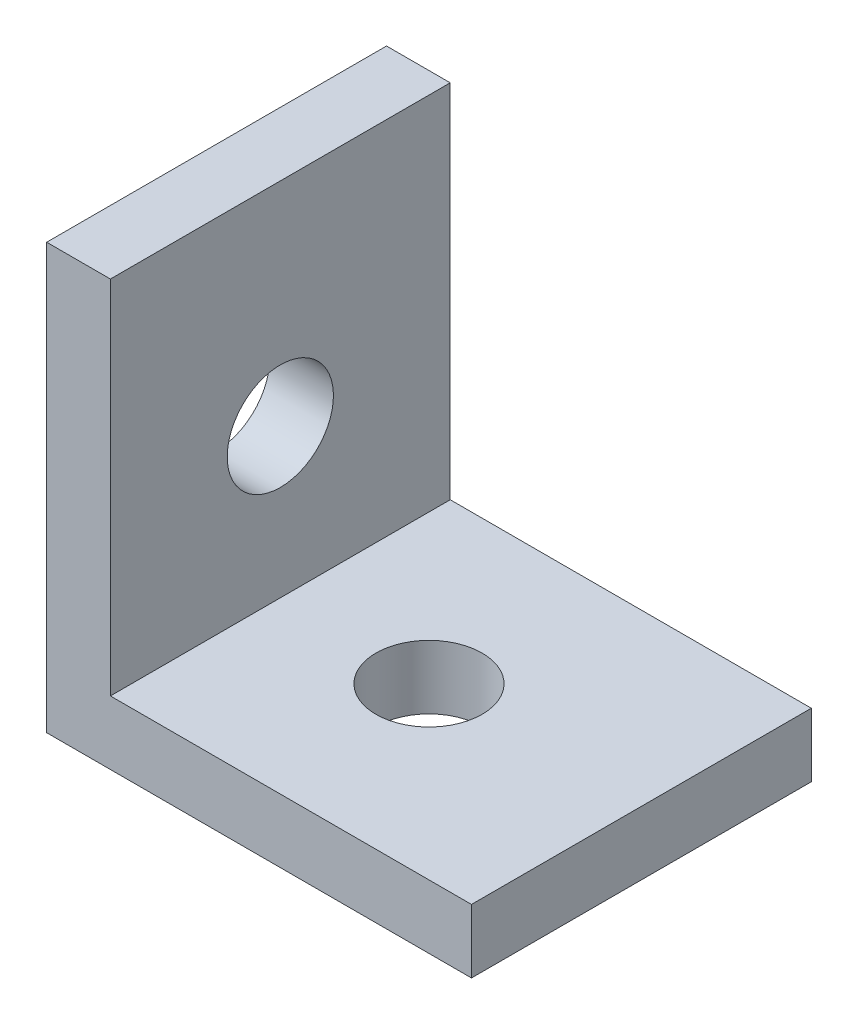
ISO-10303-21;
HEADER;
FILE_DESCRIPTION(('STEP AP214'),'2;1');
FILE_NAME('part.step','',(''),(''),'','','');
FILE_SCHEMA(('AUTOMOTIVE_DESIGN { 1 0 10303 214 1 1 1 1 }'));
ENDSEC;
DATA;
#1=APPLICATION_CONTEXT('core data for automotive mechanical design processes');
#2=APPLICATION_PROTOCOL_DEFINITION('international standard','automotive_design',2000,#1);
#3=PRODUCT_CONTEXT('',#1,'mechanical');
#4=PRODUCT('Part','Part','',(#3));
#5=PRODUCT_RELATED_PRODUCT_CATEGORY('part','',(#4));
#6=PRODUCT_DEFINITION_FORMATION('','',#4);
#7=PRODUCT_DEFINITION_CONTEXT('part definition',#1,'design');
#8=PRODUCT_DEFINITION('design','',#6,#7);
#9=PRODUCT_DEFINITION_SHAPE('','',#8);
#10=(LENGTH_UNIT() NAMED_UNIT(*) SI_UNIT(.MILLI.,.METRE.));
#11=(NAMED_UNIT(*) PLANE_ANGLE_UNIT() SI_UNIT($,.RADIAN.));
#12=(NAMED_UNIT(*) SI_UNIT($,.STERADIAN.) SOLID_ANGLE_UNIT());
#13=UNCERTAINTY_MEASURE_WITH_UNIT(LENGTH_MEASURE(1.E-05),#10,'distance_accuracy_value','');
#14=(GEOMETRIC_REPRESENTATION_CONTEXT(3) GLOBAL_UNCERTAINTY_ASSIGNED_CONTEXT((#13)) GLOBAL_UNIT_ASSIGNED_CONTEXT((#10,
#11,#12)) REPRESENTATION_CONTEXT('',''));
#15=CARTESIAN_POINT('',(0.,0.,0.));
#16=DIRECTION('',(0.,0.,1.));
#17=DIRECTION('',(1.,0.,0.));
#18=AXIS2_PLACEMENT_3D('',#15,#16,#17);
#19=CARTESIAN_POINT('',(17.,0.,16.));
#20=DIRECTION('',(0.,-1.,0.));
#21=DIRECTION('',(1.,0.,0.));
#22=AXIS2_PLACEMENT_3D('',#19,#20,#21);
#23=PLANE('',#22);
#24=CARTESIAN_POINT('',(7.,0.,8.));
#25=DIRECTION('',(0.,-1.,0.));
#26=DIRECTION('',(1.,0.,0.));
#27=AXIS2_PLACEMENT_3D('',#24,#25,#26);
#28=CIRCLE('',#27,2.5);
#29=CARTESIAN_POINT('',(9.5,0.,8.));
#30=VERTEX_POINT('',#29);
#31=EDGE_CURVE('E167',#30,#30,#28,.F.);
#32=ORIENTED_EDGE('',*,*,#31,.F.);
#33=EDGE_LOOP('',(#32));
#34=FACE_BOUND('',#33,.T.);
#35=DIRECTION('',(-1.,0.,0.));
#36=VECTOR('',#35,1.);
#37=CARTESIAN_POINT('',(17.,0.,0.));
#38=LINE('',#37,#36);
#39=CARTESIAN_POINT('',(17.,0.,0.));
#40=VERTEX_POINT('',#39);
#41=CARTESIAN_POINT('',(0.,0.,0.));
#42=VERTEX_POINT('',#41);
#43=EDGE_CURVE('E123',#40,#42,#38,.T.);
#44=ORIENTED_EDGE('',*,*,#43,.T.);
#45=DIRECTION('',(0.,0.,-1.));
#46=VECTOR('',#45,1.);
#47=CARTESIAN_POINT('',(0.,0.,16.));
#48=LINE('',#47,#46);
#49=CARTESIAN_POINT('',(0.,0.,16.));
#50=VERTEX_POINT('',#49);
#51=EDGE_CURVE('E11',#50,#42,#48,.T.);
#52=ORIENTED_EDGE('',*,*,#51,.F.);
#53=DIRECTION('',(-1.,0.,0.));
#54=VECTOR('',#53,1.);
#55=CARTESIAN_POINT('',(17.,0.,16.));
#56=LINE('',#55,#54);
#57=CARTESIAN_POINT('',(17.,0.,16.));
#58=VERTEX_POINT('',#57);
#59=EDGE_CURVE('E134',#58,#50,#56,.T.);
#60=ORIENTED_EDGE('',*,*,#59,.F.);
#61=DIRECTION('',(0.,0.,-1.));
#62=VECTOR('',#61,1.);
#63=CARTESIAN_POINT('',(17.,0.,16.));
#64=LINE('',#63,#62);
#65=EDGE_CURVE('E119',#58,#40,#64,.T.);
#66=ORIENTED_EDGE('',*,*,#65,.T.);
#67=EDGE_LOOP('',(#44,#52,#60,#66));
#68=FACE_BOUND('',#67,.T.);
#69=ADVANCED_FACE('F39',(#34,#68),#23,.F.);
#70=CARTESIAN_POINT('',(0.,0.,16.));
#71=DIRECTION('',(-1.,0.,0.));
#72=DIRECTION('',(0.,-1.,0.));
#73=AXIS2_PLACEMENT_3D('',#70,#71,#72);
#74=PLANE('',#73);
#75=CARTESIAN_POINT('',(0.,7.,8.));
#76=DIRECTION('',(-1.,0.,0.));
#77=DIRECTION('',(0.,-1.,0.));
#78=AXIS2_PLACEMENT_3D('',#75,#76,#77);
#79=CIRCLE('',#78,2.5);
#80=CARTESIAN_POINT('',(0.,4.5,8.));
#81=VERTEX_POINT('',#80);
#82=EDGE_CURVE('E127',#81,#81,#79,.F.);
#83=ORIENTED_EDGE('',*,*,#82,.F.);
#84=EDGE_LOOP('',(#83));
#85=FACE_BOUND('',#84,.T.);
#86=DIRECTION('',(0.,1.,0.));
#87=VECTOR('',#86,1.);
#88=CARTESIAN_POINT('',(0.,0.,0.));
#89=LINE('',#88,#87);
#90=CARTESIAN_POINT('',(0.,17.,0.));
#91=VERTEX_POINT('',#90);
#92=EDGE_CURVE('E126',#42,#91,#89,.T.);
#93=ORIENTED_EDGE('',*,*,#92,.T.);
#94=DIRECTION('',(0.,0.,-1.));
#95=VECTOR('',#94,1.);
#96=CARTESIAN_POINT('',(0.,17.,16.));
#97=LINE('',#96,#95);
#98=CARTESIAN_POINT('',(0.,17.,16.));
#99=VERTEX_POINT('',#98);
#100=EDGE_CURVE('E47',#99,#91,#97,.T.);
#101=ORIENTED_EDGE('',*,*,#100,.F.);
#102=DIRECTION('',(0.,1.,0.));
#103=VECTOR('',#102,1.);
#104=CARTESIAN_POINT('',(0.,0.,16.));
#105=LINE('',#104,#103);
#106=EDGE_CURVE('E92',#50,#99,#105,.T.);
#107=ORIENTED_EDGE('',*,*,#106,.F.);
#108=ORIENTED_EDGE('',*,*,#51,.T.);
#109=EDGE_LOOP('',(#93,#101,#107,#108));
#110=FACE_BOUND('',#109,.T.);
#111=ADVANCED_FACE('F159',(#85,#110),#74,.F.);
#112=CARTESIAN_POINT('',(0.,17.,16.));
#113=DIRECTION('',(0.,-1.,0.));
#114=DIRECTION('',(0.,0.,-1.));
#115=AXIS2_PLACEMENT_3D('',#112,#113,#114);
#116=PLANE('',#115);
#117=DIRECTION('',(-1.,0.,0.));
#118=VECTOR('',#117,1.);
#119=CARTESIAN_POINT('',(0.,17.,0.));
#120=LINE('',#119,#118);
#121=CARTESIAN_POINT('',(-3.,17.,0.));
#122=VERTEX_POINT('',#121);
#123=EDGE_CURVE('E129',#91,#122,#120,.T.);
#124=ORIENTED_EDGE('',*,*,#123,.T.);
#125=DIRECTION('',(0.,0.,-1.));
#126=VECTOR('',#125,1.);
#127=CARTESIAN_POINT('',(-3.,17.,16.));
#128=LINE('',#127,#126);
#129=CARTESIAN_POINT('',(-3.,17.,16.));
#130=VERTEX_POINT('',#129);
#131=EDGE_CURVE('E114',#130,#122,#128,.T.);
#132=ORIENTED_EDGE('',*,*,#131,.F.);
#133=DIRECTION('',(-1.,0.,0.));
#134=VECTOR('',#133,1.);
#135=CARTESIAN_POINT('',(0.,17.,16.));
#136=LINE('',#135,#134);
#137=EDGE_CURVE('E105',#99,#130,#136,.T.);
#138=ORIENTED_EDGE('',*,*,#137,.F.);
#139=ORIENTED_EDGE('',*,*,#100,.T.);
#140=EDGE_LOOP('',(#124,#132,#138,#139));
#141=FACE_BOUND('',#140,.T.);
#142=ADVANCED_FACE('F140',(#141),#116,.F.);
#143=CARTESIAN_POINT('',(-3.,17.,16.));
#144=DIRECTION('',(1.,0.,0.));
#145=DIRECTION('',(0.,1.,0.));
#146=AXIS2_PLACEMENT_3D('',#143,#144,#145);
#147=PLANE('',#146);
#148=CARTESIAN_POINT('',(-3.,7.,8.));
#149=DIRECTION('',(-1.,0.,0.));
#150=DIRECTION('',(0.,-1.,0.));
#151=AXIS2_PLACEMENT_3D('',#148,#149,#150);
#152=CIRCLE('',#151,2.5);
#153=CARTESIAN_POINT('',(-3.,4.5,8.));
#154=VERTEX_POINT('',#153);
#155=EDGE_CURVE('E169',#154,#154,#152,.T.);
#156=ORIENTED_EDGE('',*,*,#155,.F.);
#157=EDGE_LOOP('',(#156));
#158=FACE_BOUND('',#157,.T.);
#159=DIRECTION('',(0.,-1.,0.));
#160=VECTOR('',#159,1.);
#161=CARTESIAN_POINT('',(-3.,17.,0.));
#162=LINE('',#161,#160);
#163=CARTESIAN_POINT('',(-3.,-3.00000000000001,0.));
#164=VERTEX_POINT('',#163);
#165=EDGE_CURVE('E113',#122,#164,#162,.T.);
#166=ORIENTED_EDGE('',*,*,#165,.T.);
#167=DIRECTION('',(0.,0.,-1.));
#168=VECTOR('',#167,1.);
#169=CARTESIAN_POINT('',(-3.,-3.00000000000001,16.));
#170=LINE('',#169,#168);
#171=CARTESIAN_POINT('',(-3.,-3.00000000000001,16.));
#172=VERTEX_POINT('',#171);
#173=EDGE_CURVE('E110',#172,#164,#170,.T.);
#174=ORIENTED_EDGE('',*,*,#173,.F.);
#175=DIRECTION('',(0.,-1.,0.));
#176=VECTOR('',#175,1.);
#177=CARTESIAN_POINT('',(-3.,17.,16.));
#178=LINE('',#177,#176);
#179=EDGE_CURVE('E99',#130,#172,#178,.T.);
#180=ORIENTED_EDGE('',*,*,#179,.F.);
#181=ORIENTED_EDGE('',*,*,#131,.T.);
#182=EDGE_LOOP('',(#166,#174,#180,#181));
#183=FACE_BOUND('',#182,.T.);
#184=ADVANCED_FACE('F111',(#158,#183),#147,.F.);
#185=CARTESIAN_POINT('',(-3.,-3.00000000000001,16.));
#186=DIRECTION('',(0.,1.,0.));
#187=DIRECTION('',(-1.,0.,0.));
#188=AXIS2_PLACEMENT_3D('',#185,#186,#187);
#189=PLANE('',#188);
#190=CARTESIAN_POINT('',(7.,-3.,8.));
#191=DIRECTION('',(0.,-1.,0.));
#192=DIRECTION('',(1.,0.,0.));
#193=AXIS2_PLACEMENT_3D('',#190,#191,#192);
#194=CIRCLE('',#193,2.5);
#195=CARTESIAN_POINT('',(9.5,-3.,8.));
#196=VERTEX_POINT('',#195);
#197=EDGE_CURVE('E170',#196,#196,#194,.T.);
#198=ORIENTED_EDGE('',*,*,#197,.F.);
#199=EDGE_LOOP('',(#198));
#200=FACE_BOUND('',#199,.T.);
#201=DIRECTION('',(1.,0.,0.));
#202=VECTOR('',#201,1.);
#203=CARTESIAN_POINT('',(-3.,-3.00000000000001,0.));
#204=LINE('',#203,#202);
#205=CARTESIAN_POINT('',(17.,-3.,0.));
#206=VERTEX_POINT('',#205);
#207=EDGE_CURVE('E78',#164,#206,#204,.T.);
#208=ORIENTED_EDGE('',*,*,#207,.T.);
#209=DIRECTION('',(0.,0.,-1.));
#210=VECTOR('',#209,1.);
#211=CARTESIAN_POINT('',(17.,-3.,16.));
#212=LINE('',#211,#210);
#213=CARTESIAN_POINT('',(17.,-3.,16.));
#214=VERTEX_POINT('',#213);
#215=EDGE_CURVE('E115',#214,#206,#212,.T.);
#216=ORIENTED_EDGE('',*,*,#215,.F.);
#217=DIRECTION('',(1.,0.,0.));
#218=VECTOR('',#217,1.);
#219=CARTESIAN_POINT('',(-3.,-3.00000000000001,16.));
#220=LINE('',#219,#218);
#221=EDGE_CURVE('E103',#172,#214,#220,.T.);
#222=ORIENTED_EDGE('',*,*,#221,.F.);
#223=ORIENTED_EDGE('',*,*,#173,.T.);
#224=EDGE_LOOP('',(#208,#216,#222,#223));
#225=FACE_BOUND('',#224,.T.);
#226=ADVANCED_FACE('F117',(#200,#225),#189,.F.);
#227=CARTESIAN_POINT('',(17.,-3.,16.));
#228=DIRECTION('',(-1.,0.,0.));
#229=DIRECTION('',(0.,0.,1.));
#230=AXIS2_PLACEMENT_3D('',#227,#228,#229);
#231=PLANE('',#230);
#232=DIRECTION('',(0.,1.,0.));
#233=VECTOR('',#232,1.);
#234=CARTESIAN_POINT('',(17.,-3.,0.));
#235=LINE('',#234,#233);
#236=EDGE_CURVE('E84',#206,#40,#235,.T.);
#237=ORIENTED_EDGE('',*,*,#236,.T.);
#238=ORIENTED_EDGE('',*,*,#65,.F.);
#239=DIRECTION('',(0.,1.,0.));
#240=VECTOR('',#239,1.);
#241=CARTESIAN_POINT('',(17.,-3.,16.));
#242=LINE('',#241,#240);
#243=EDGE_CURVE('E55',#214,#58,#242,.T.);
#244=ORIENTED_EDGE('',*,*,#243,.F.);
#245=ORIENTED_EDGE('',*,*,#215,.T.);
#246=EDGE_LOOP('',(#237,#238,#244,#245));
#247=FACE_BOUND('',#246,.T.);
#248=ADVANCED_FACE('F147',(#247),#231,.F.);
#249=CARTESIAN_POINT('',(0.,0.,16.));
#250=DIRECTION('',(0.,0.,-1.));
#251=DIRECTION('',(-1.,0.,0.));
#252=AXIS2_PLACEMENT_3D('',#249,#250,#251);
#253=PLANE('',#252);
#254=ORIENTED_EDGE('',*,*,#59,.T.);
#255=ORIENTED_EDGE('',*,*,#106,.T.);
#256=ORIENTED_EDGE('',*,*,#137,.T.);
#257=ORIENTED_EDGE('',*,*,#179,.T.);
#258=ORIENTED_EDGE('',*,*,#221,.T.);
#259=ORIENTED_EDGE('',*,*,#243,.T.);
#260=EDGE_LOOP('',(#254,#255,#256,#257,#258,#259));
#261=FACE_BOUND('',#260,.T.);
#262=ADVANCED_FACE('F101',(#261),#253,.F.);
#263=CARTESIAN_POINT('',(0.,0.,0.));
#264=DIRECTION('',(0.,0.,-1.));
#265=DIRECTION('',(-1.,0.,0.));
#266=AXIS2_PLACEMENT_3D('',#263,#264,#265);
#267=PLANE('',#266);
#268=ORIENTED_EDGE('',*,*,#43,.F.);
#269=ORIENTED_EDGE('',*,*,#236,.F.);
#270=ORIENTED_EDGE('',*,*,#207,.F.);
#271=ORIENTED_EDGE('',*,*,#165,.F.);
#272=ORIENTED_EDGE('',*,*,#123,.F.);
#273=ORIENTED_EDGE('',*,*,#92,.F.);
#274=EDGE_LOOP('',(#268,#269,#270,#271,#272,#273));
#275=FACE_BOUND('',#274,.T.);
#276=ADVANCED_FACE('F143',(#275),#267,.T.);
#277=CARTESIAN_POINT('',(17.001,7.,8.));
#278=DIRECTION('',(-1.,0.,0.));
#279=DIRECTION('',(0.,-1.,0.));
#280=AXIS2_PLACEMENT_3D('',#277,#278,#279);
#281=CYLINDRICAL_SURFACE('',#280,2.5);
#282=ORIENTED_EDGE('',*,*,#155,.T.);
#283=EDGE_LOOP('',(#282));
#284=FACE_BOUND('',#283,.T.);
#285=ORIENTED_EDGE('',*,*,#82,.T.);
#286=EDGE_LOOP('',(#285));
#287=FACE_BOUND('',#286,.T.);
#288=ADVANCED_FACE('F182',(#284,#287),#281,.F.);
#289=CARTESIAN_POINT('',(6.99999999999999,17.001,8.));
#290=DIRECTION('',(0.,-1.,0.));
#291=DIRECTION('',(1.,0.,0.));
#292=AXIS2_PLACEMENT_3D('',#289,#290,#291);
#293=CYLINDRICAL_SURFACE('',#292,2.5);
#294=ORIENTED_EDGE('',*,*,#197,.T.);
#295=EDGE_LOOP('',(#294));
#296=FACE_BOUND('',#295,.T.);
#297=ORIENTED_EDGE('',*,*,#31,.T.);
#298=EDGE_LOOP('',(#297));
#299=FACE_BOUND('',#298,.T.);
#300=ADVANCED_FACE('F184',(#296,#299),#293,.F.);
#301=CLOSED_SHELL('',(#69,#111,#142,#184,#226,#248,#262,#276,#288,#300));
#302=MANIFOLD_SOLID_BREP('B2',#301);
#303=ADVANCED_BREP_SHAPE_REPRESENTATION('',(#18,#302),#14);
#304=SHAPE_DEFINITION_REPRESENTATION(#9,#303);
ENDSEC;
END-ISO-10303-21;
